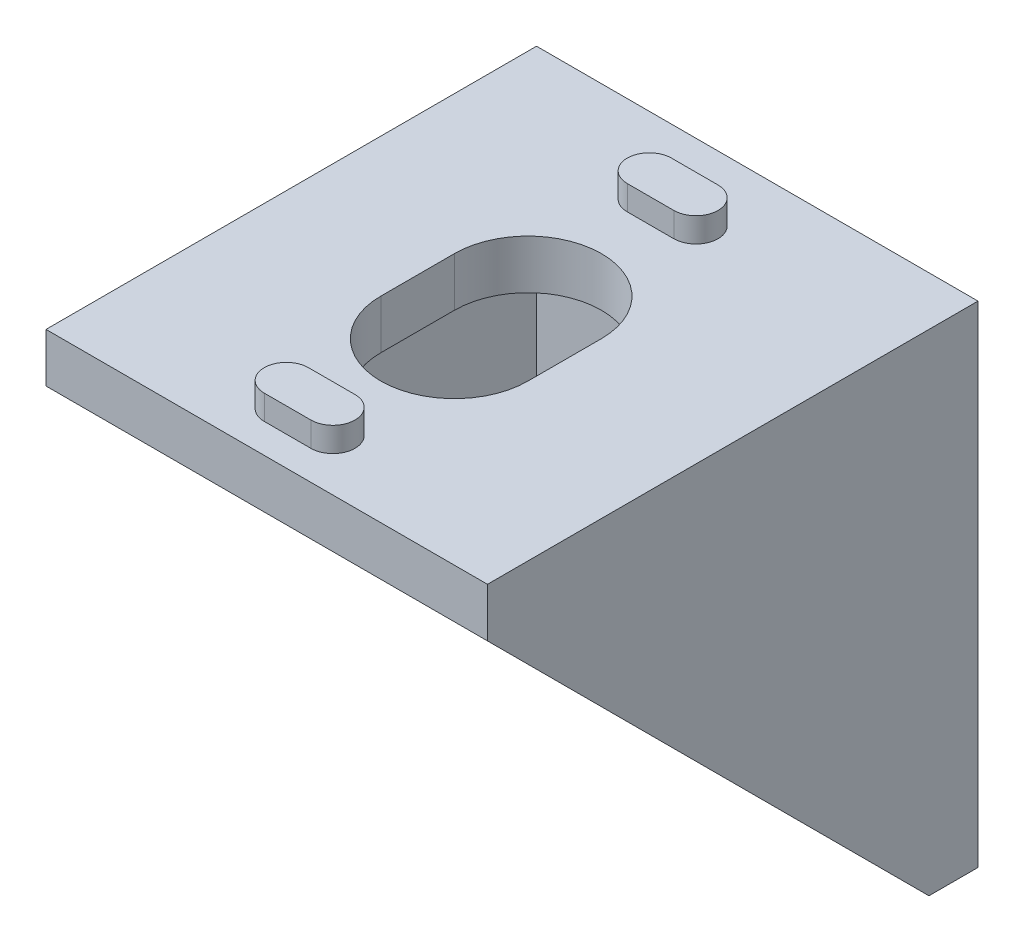
ISO-10303-21;
HEADER;
FILE_DESCRIPTION(('STEP AP214'),'2;1');
FILE_NAME('part.step','',(''),(''),'','','');
FILE_SCHEMA(('AUTOMOTIVE_DESIGN { 1 0 10303 214 1 1 1 1 }'));
ENDSEC;
DATA;
#1=APPLICATION_CONTEXT('core data for automotive mechanical design processes');
#2=APPLICATION_PROTOCOL_DEFINITION('international standard','automotive_design',2000,#1);
#3=PRODUCT_CONTEXT('',#1,'mechanical');
#4=PRODUCT('Part','Part','',(#3));
#5=PRODUCT_RELATED_PRODUCT_CATEGORY('part','',(#4));
#6=PRODUCT_DEFINITION_FORMATION('','',#4);
#7=PRODUCT_DEFINITION_CONTEXT('part definition',#1,'design');
#8=PRODUCT_DEFINITION('design','',#6,#7);
#9=PRODUCT_DEFINITION_SHAPE('','',#8);
#10=(LENGTH_UNIT() NAMED_UNIT(*) SI_UNIT(.MILLI.,.METRE.));
#11=(NAMED_UNIT(*) PLANE_ANGLE_UNIT() SI_UNIT($,.RADIAN.));
#12=(NAMED_UNIT(*) SI_UNIT($,.STERADIAN.) SOLID_ANGLE_UNIT());
#13=UNCERTAINTY_MEASURE_WITH_UNIT(LENGTH_MEASURE(1.E-05),#10,'distance_accuracy_value','');
#14=(GEOMETRIC_REPRESENTATION_CONTEXT(3) GLOBAL_UNCERTAINTY_ASSIGNED_CONTEXT((#13)) GLOBAL_UNIT_ASSIGNED_CONTEXT((#10,
#11,#12)) REPRESENTATION_CONTEXT('',''));
#15=CARTESIAN_POINT('',(0.,0.,0.));
#16=DIRECTION('',(0.,0.,1.));
#17=DIRECTION('',(1.,0.,0.));
#18=AXIS2_PLACEMENT_3D('',#15,#16,#17);
#19=CARTESIAN_POINT('',(-9.,10.,0.));
#20=DIRECTION('',(0.,0.,1.));
#21=DIRECTION('',(1.,0.,0.));
#22=AXIS2_PLACEMENT_3D('',#19,#20,#21);
#23=PLANE('',#22);
#24=DIRECTION('',(0.,-1.,0.));
#25=VECTOR('',#24,1.);
#26=CARTESIAN_POINT('',(-12.3501123042702,10.5,0.));
#27=LINE('',#26,#25);
#28=CARTESIAN_POINT('',(-12.3501123042702,11.,0.));
#29=VERTEX_POINT('',#28);
#30=CARTESIAN_POINT('',(-12.3501123042702,8.,0.));
#31=VERTEX_POINT('',#30);
#32=EDGE_CURVE('E383',#29,#31,#27,.T.);
#33=ORIENTED_EDGE('',*,*,#32,.T.);
#34=CARTESIAN_POINT('',(-9.35011230427015,8.,0.));
#35=DIRECTION('',(0.,0.,1.));
#36=DIRECTION('',(1.,0.,0.));
#37=AXIS2_PLACEMENT_3D('',#34,#35,#36);
#38=CIRCLE('',#37,3.);
#39=CARTESIAN_POINT('',(-6.35011230427015,8.,0.));
#40=VERTEX_POINT('',#39);
#41=EDGE_CURVE('E419',#31,#40,#38,.T.);
#42=ORIENTED_EDGE('',*,*,#41,.T.);
#43=DIRECTION('',(0.,1.,0.));
#44=VECTOR('',#43,1.);
#45=CARTESIAN_POINT('',(-6.35011230427015,9.,0.));
#46=LINE('',#45,#44);
#47=CARTESIAN_POINT('',(-6.35011230427015,11.,0.));
#48=VERTEX_POINT('',#47);
#49=EDGE_CURVE('E409',#40,#48,#46,.T.);
#50=ORIENTED_EDGE('',*,*,#49,.T.);
#51=CARTESIAN_POINT('',(-9.35011230427015,11.,0.));
#52=DIRECTION('',(0.,0.,1.));
#53=DIRECTION('',(-1.,0.,0.));
#54=AXIS2_PLACEMENT_3D('',#51,#52,#53);
#55=CIRCLE('',#54,3.);
#56=EDGE_CURVE('E400',#48,#29,#55,.T.);
#57=ORIENTED_EDGE('',*,*,#56,.T.);
#58=EDGE_LOOP('',(#33,#42,#50,#57));
#59=FACE_BOUND('',#58,.T.);
#60=CARTESIAN_POINT('',(-8.40011230427015,2.1,0.));
#61=DIRECTION('',(0.,0.,1.));
#62=DIRECTION('',(0.,1.,0.));
#63=AXIS2_PLACEMENT_3D('',#60,#61,#62);
#64=CIRCLE('',#63,0.9);
#65=CARTESIAN_POINT('',(-8.40011230427015,1.2,0.));
#66=VERTEX_POINT('',#65);
#67=CARTESIAN_POINT('',(-8.40011230427015,3.,0.));
#68=VERTEX_POINT('',#67);
#69=EDGE_CURVE('E299',#66,#68,#64,.T.);
#70=ORIENTED_EDGE('',*,*,#69,.T.);
#71=DIRECTION('',(-1.,0.,0.));
#72=VECTOR('',#71,1.);
#73=CARTESIAN_POINT('',(-9.65005615213507,3.,0.));
#74=LINE('',#73,#72);
#75=CARTESIAN_POINT('',(-10.3001123042701,3.,0.));
#76=VERTEX_POINT('',#75);
#77=EDGE_CURVE('E340',#68,#76,#74,.T.);
#78=ORIENTED_EDGE('',*,*,#77,.T.);
#79=CARTESIAN_POINT('',(-10.3001123042702,2.1,0.));
#80=DIRECTION('',(0.,0.,1.));
#81=DIRECTION('',(0.,-1.,0.));
#82=AXIS2_PLACEMENT_3D('',#79,#80,#81);
#83=CIRCLE('',#82,0.9);
#84=CARTESIAN_POINT('',(-10.3001123042702,1.2,0.));
#85=VERTEX_POINT('',#84);
#86=EDGE_CURVE('E301',#76,#85,#83,.T.);
#87=ORIENTED_EDGE('',*,*,#86,.T.);
#88=DIRECTION('',(1.,0.,0.));
#89=VECTOR('',#88,1.);
#90=CARTESIAN_POINT('',(-8.70005615213508,1.2,0.));
#91=LINE('',#90,#89);
#92=EDGE_CURVE('E294',#85,#66,#91,.T.);
#93=ORIENTED_EDGE('',*,*,#92,.T.);
#94=EDGE_LOOP('',(#70,#78,#87,#93));
#95=FACE_BOUND('',#94,.T.);
#96=DIRECTION('',(1.,0.,0.));
#97=VECTOR('',#96,1.);
#98=CARTESIAN_POINT('',(-8.70005615213507,16.,0.));
#99=LINE('',#98,#97);
#100=CARTESIAN_POINT('',(-10.3001123042702,16.,0.));
#101=VERTEX_POINT('',#100);
#102=CARTESIAN_POINT('',(-8.40011230427015,16.,0.));
#103=VERTEX_POINT('',#102);
#104=EDGE_CURVE('E1059',#101,#103,#99,.T.);
#105=ORIENTED_EDGE('',*,*,#104,.T.);
#106=CARTESIAN_POINT('',(-8.40011230427015,16.9,0.));
#107=DIRECTION('',(0.,0.,1.));
#108=DIRECTION('',(0.,1.,0.));
#109=AXIS2_PLACEMENT_3D('',#106,#107,#108);
#110=CIRCLE('',#109,0.9);
#111=CARTESIAN_POINT('',(-8.40011230427015,17.8,0.));
#112=VERTEX_POINT('',#111);
#113=EDGE_CURVE('E615',#103,#112,#110,.T.);
#114=ORIENTED_EDGE('',*,*,#113,.T.);
#115=DIRECTION('',(-1.,0.,0.));
#116=VECTOR('',#115,1.);
#117=CARTESIAN_POINT('',(-9.65005615213508,17.8,0.));
#118=LINE('',#117,#116);
#119=CARTESIAN_POINT('',(-10.3001123042702,17.8,0.));
#120=VERTEX_POINT('',#119);
#121=EDGE_CURVE('E633',#112,#120,#118,.T.);
#122=ORIENTED_EDGE('',*,*,#121,.T.);
#123=CARTESIAN_POINT('',(-10.3001123042702,16.9,0.));
#124=DIRECTION('',(0.,0.,1.));
#125=DIRECTION('',(0.,-1.,0.));
#126=AXIS2_PLACEMENT_3D('',#123,#124,#125);
#127=CIRCLE('',#126,0.9);
#128=EDGE_CURVE('E328',#120,#101,#127,.T.);
#129=ORIENTED_EDGE('',*,*,#128,.T.);
#130=EDGE_LOOP('',(#105,#114,#122,#129));
#131=FACE_BOUND('',#130,.T.);
#132=DIRECTION('',(0.,1.,0.));
#133=VECTOR('',#132,1.);
#134=CARTESIAN_POINT('',(0.,0.,0.));
#135=LINE('',#134,#133);
#136=CARTESIAN_POINT('',(0.,0.,0.));
#137=VERTEX_POINT('',#136);
#138=CARTESIAN_POINT('',(0.,20.,0.));
#139=VERTEX_POINT('',#138);
#140=EDGE_CURVE('E11',#137,#139,#135,.T.);
#141=ORIENTED_EDGE('',*,*,#140,.F.);
#142=DIRECTION('',(1.,0.,0.));
#143=VECTOR('',#142,1.);
#144=CARTESIAN_POINT('',(-18.,0.,0.));
#145=LINE('',#144,#143);
#146=CARTESIAN_POINT('',(-18.,0.,0.));
#147=VERTEX_POINT('',#146);
#148=EDGE_CURVE('E366',#147,#137,#145,.T.);
#149=ORIENTED_EDGE('',*,*,#148,.F.);
#150=DIRECTION('',(0.,-1.,0.));
#151=VECTOR('',#150,1.);
#152=CARTESIAN_POINT('',(-18.,20.,0.));
#153=LINE('',#152,#151);
#154=CARTESIAN_POINT('',(-18.,20.,0.));
#155=VERTEX_POINT('',#154);
#156=EDGE_CURVE('E374',#155,#147,#153,.T.);
#157=ORIENTED_EDGE('',*,*,#156,.F.);
#158=DIRECTION('',(-1.,0.,0.));
#159=VECTOR('',#158,1.);
#160=CARTESIAN_POINT('',(0.,20.,0.));
#161=LINE('',#160,#159);
#162=EDGE_CURVE('E44',#139,#155,#161,.T.);
#163=ORIENTED_EDGE('',*,*,#162,.F.);
#164=EDGE_LOOP('',(#141,#149,#157,#163));
#165=FACE_BOUND('',#164,.T.);
#166=ADVANCED_FACE('F17',(#59,#95,#131,#165),#23,.F.);
#167=CARTESIAN_POINT('',(0.,0.,0.));
#168=DIRECTION('',(1.,0.,0.));
#169=DIRECTION('',(0.,1.,0.));
#170=AXIS2_PLACEMENT_3D('',#167,#168,#169);
#171=PLANE('',#170);
#172=ORIENTED_EDGE('',*,*,#140,.T.);
#173=DIRECTION('',(0.,0.,1.));
#174=VECTOR('',#173,1.);
#175=CARTESIAN_POINT('',(0.,20.,0.));
#176=LINE('',#175,#174);
#177=CARTESIAN_POINT('',(0.,20.,20.));
#178=VERTEX_POINT('',#177);
#179=EDGE_CURVE('E20',#139,#178,#176,.T.);
#180=ORIENTED_EDGE('',*,*,#179,.T.);
#181=DIRECTION('',(0.,1.,0.));
#182=VECTOR('',#181,1.);
#183=CARTESIAN_POINT('',(0.,0.,20.));
#184=LINE('',#183,#182);
#185=CARTESIAN_POINT('',(0.,18.,20.));
#186=VERTEX_POINT('',#185);
#187=EDGE_CURVE('E484',#186,#178,#184,.T.);
#188=ORIENTED_EDGE('',*,*,#187,.F.);
#189=DIRECTION('',(0.,-0.707106781186548,-0.707106781186548));
#190=VECTOR('',#189,1.);
#191=CARTESIAN_POINT('',(0.,18.,20.));
#192=LINE('',#191,#190);
#193=CARTESIAN_POINT('',(0.,0.,2.));
#194=VERTEX_POINT('',#193);
#195=EDGE_CURVE('E463',#186,#194,#192,.T.);
#196=ORIENTED_EDGE('',*,*,#195,.T.);
#197=DIRECTION('',(0.,0.,1.));
#198=VECTOR('',#197,1.);
#199=CARTESIAN_POINT('',(0.,0.,0.));
#200=LINE('',#199,#198);
#201=EDGE_CURVE('E365',#137,#194,#200,.T.);
#202=ORIENTED_EDGE('',*,*,#201,.F.);
#203=EDGE_LOOP('',(#172,#180,#188,#196,#202));
#204=FACE_BOUND('',#203,.T.);
#205=ADVANCED_FACE('F681',(#204),#171,.T.);
#206=CARTESIAN_POINT('',(0.,20.,0.));
#207=DIRECTION('',(0.,1.,0.));
#208=DIRECTION('',(1.,0.,0.));
#209=AXIS2_PLACEMENT_3D('',#206,#207,#208);
#210=PLANE('',#209);
#211=DIRECTION('',(0.,0.,-1.));
#212=VECTOR('',#211,1.);
#213=CARTESIAN_POINT('',(-12.3501123042702,20.,6.));
#214=LINE('',#213,#212);
#215=CARTESIAN_POINT('',(-12.3501123042702,20.,12.));
#216=VERTEX_POINT('',#215);
#217=CARTESIAN_POINT('',(-12.3501123042702,20.,9.));
#218=VERTEX_POINT('',#217);
#219=EDGE_CURVE('E521',#216,#218,#214,.T.);
#220=ORIENTED_EDGE('',*,*,#219,.T.);
#221=CARTESIAN_POINT('',(-9.35011230427015,20.,9.));
#222=DIRECTION('',(0.,-1.,0.));
#223=DIRECTION('',(1.,0.,0.));
#224=AXIS2_PLACEMENT_3D('',#221,#222,#223);
#225=CIRCLE('',#224,3.);
#226=CARTESIAN_POINT('',(-6.35011230427015,20.,9.));
#227=VERTEX_POINT('',#226);
#228=EDGE_CURVE('E549',#218,#227,#225,.T.);
#229=ORIENTED_EDGE('',*,*,#228,.T.);
#230=DIRECTION('',(0.,0.,1.));
#231=VECTOR('',#230,1.);
#232=CARTESIAN_POINT('',(-6.35011230427015,20.,4.5));
#233=LINE('',#232,#231);
#234=CARTESIAN_POINT('',(-6.35011230427015,20.,12.));
#235=VERTEX_POINT('',#234);
#236=EDGE_CURVE('E439',#227,#235,#233,.T.);
#237=ORIENTED_EDGE('',*,*,#236,.T.);
#238=CARTESIAN_POINT('',(-9.35011230427015,20.,12.));
#239=DIRECTION('',(0.,-1.,0.));
#240=DIRECTION('',(-1.,0.,0.));
#241=AXIS2_PLACEMENT_3D('',#238,#239,#240);
#242=CIRCLE('',#241,3.);
#243=EDGE_CURVE('E529',#235,#216,#242,.T.);
#244=ORIENTED_EDGE('',*,*,#243,.T.);
#245=EDGE_LOOP('',(#220,#229,#237,#244));
#246=FACE_BOUND('',#245,.T.);
#247=DIRECTION('',(-1.,0.,0.));
#248=VECTOR('',#247,1.);
#249=CARTESIAN_POINT('',(-5.15005615213508,20.,4.));
#250=LINE('',#249,#248);
#251=CARTESIAN_POINT('',(-8.40011230427015,20.,4.));
#252=VERTEX_POINT('',#251);
#253=CARTESIAN_POINT('',(-10.3001123042702,20.,4.));
#254=VERTEX_POINT('',#253);
#255=EDGE_CURVE('E481',#252,#254,#250,.T.);
#256=ORIENTED_EDGE('',*,*,#255,.T.);
#257=CARTESIAN_POINT('',(-10.3001123042702,20.,3.1));
#258=DIRECTION('',(0.,-1.,0.));
#259=DIRECTION('',(0.,0.,-1.));
#260=AXIS2_PLACEMENT_3D('',#257,#258,#259);
#261=CIRCLE('',#260,0.9);
#262=CARTESIAN_POINT('',(-10.3001123042702,20.,2.2));
#263=VERTEX_POINT('',#262);
#264=EDGE_CURVE('E422',#254,#263,#261,.T.);
#265=ORIENTED_EDGE('',*,*,#264,.T.);
#266=DIRECTION('',(1.,0.,0.));
#267=VECTOR('',#266,1.);
#268=CARTESIAN_POINT('',(-4.20005615213507,20.,2.2));
#269=LINE('',#268,#267);
#270=CARTESIAN_POINT('',(-8.40011230427015,20.,2.2));
#271=VERTEX_POINT('',#270);
#272=EDGE_CURVE('E505',#263,#271,#269,.T.);
#273=ORIENTED_EDGE('',*,*,#272,.T.);
#274=CARTESIAN_POINT('',(-8.40011230427015,20.,3.1));
#275=DIRECTION('',(0.,-1.,0.));
#276=DIRECTION('',(0.,0.,1.));
#277=AXIS2_PLACEMENT_3D('',#274,#275,#276);
#278=CIRCLE('',#277,0.9);
#279=EDGE_CURVE('E405',#271,#252,#278,.T.);
#280=ORIENTED_EDGE('',*,*,#279,.T.);
#281=EDGE_LOOP('',(#256,#265,#273,#280));
#282=FACE_BOUND('',#281,.T.);
#283=DIRECTION('',(-1.,0.,0.));
#284=VECTOR('',#283,1.);
#285=CARTESIAN_POINT('',(-5.15005615213508,20.,18.8));
#286=LINE('',#285,#284);
#287=CARTESIAN_POINT('',(-8.40011230427015,20.,18.8));
#288=VERTEX_POINT('',#287);
#289=CARTESIAN_POINT('',(-10.3001123042702,20.,18.8));
#290=VERTEX_POINT('',#289);
#291=EDGE_CURVE('E435',#288,#290,#286,.T.);
#292=ORIENTED_EDGE('',*,*,#291,.T.);
#293=CARTESIAN_POINT('',(-10.3001123042702,20.,17.9));
#294=DIRECTION('',(0.,-1.,0.));
#295=DIRECTION('',(0.,0.,-1.));
#296=AXIS2_PLACEMENT_3D('',#293,#294,#295);
#297=CIRCLE('',#296,0.9);
#298=CARTESIAN_POINT('',(-10.3001123042702,20.,17.));
#299=VERTEX_POINT('',#298);
#300=EDGE_CURVE('E452',#290,#299,#297,.T.);
#301=ORIENTED_EDGE('',*,*,#300,.T.);
#302=DIRECTION('',(1.,0.,0.));
#303=VECTOR('',#302,1.);
#304=CARTESIAN_POINT('',(-4.20005615213508,20.,17.));
#305=LINE('',#304,#303);
#306=CARTESIAN_POINT('',(-8.40011230427015,20.,17.));
#307=VERTEX_POINT('',#306);
#308=EDGE_CURVE('E462',#299,#307,#305,.T.);
#309=ORIENTED_EDGE('',*,*,#308,.T.);
#310=CARTESIAN_POINT('',(-8.40011230427015,20.,17.9));
#311=DIRECTION('',(0.,-1.,0.));
#312=DIRECTION('',(0.,0.,1.));
#313=AXIS2_PLACEMENT_3D('',#310,#311,#312);
#314=CIRCLE('',#313,0.9);
#315=EDGE_CURVE('E346',#307,#288,#314,.T.);
#316=ORIENTED_EDGE('',*,*,#315,.T.);
#317=EDGE_LOOP('',(#292,#301,#309,#316));
#318=FACE_BOUND('',#317,.T.);
#319=ORIENTED_EDGE('',*,*,#162,.T.);
#320=DIRECTION('',(0.,0.,1.));
#321=VECTOR('',#320,1.);
#322=CARTESIAN_POINT('',(-18.,20.,0.));
#323=LINE('',#322,#321);
#324=CARTESIAN_POINT('',(-18.,20.,20.));
#325=VERTEX_POINT('',#324);
#326=EDGE_CURVE('E546',#155,#325,#323,.T.);
#327=ORIENTED_EDGE('',*,*,#326,.T.);
#328=DIRECTION('',(-1.,0.,0.));
#329=VECTOR('',#328,1.);
#330=CARTESIAN_POINT('',(0.,20.,20.));
#331=LINE('',#330,#329);
#332=EDGE_CURVE('E591',#178,#325,#331,.T.);
#333=ORIENTED_EDGE('',*,*,#332,.F.);
#334=ORIENTED_EDGE('',*,*,#179,.F.);
#335=EDGE_LOOP('',(#319,#327,#333,#334));
#336=FACE_BOUND('',#335,.T.);
#337=ADVANCED_FACE('F684',(#246,#282,#318,#336),#210,.T.);
#338=CARTESIAN_POINT('',(-18.,20.,0.));
#339=DIRECTION('',(-1.,0.,0.));
#340=DIRECTION('',(0.,0.,1.));
#341=AXIS2_PLACEMENT_3D('',#338,#339,#340);
#342=PLANE('',#341);
#343=ORIENTED_EDGE('',*,*,#156,.T.);
#344=DIRECTION('',(0.,0.,1.));
#345=VECTOR('',#344,1.);
#346=CARTESIAN_POINT('',(-18.,0.,0.));
#347=LINE('',#346,#345);
#348=CARTESIAN_POINT('',(-18.,0.,2.));
#349=VERTEX_POINT('',#348);
#350=EDGE_CURVE('E370',#147,#349,#347,.T.);
#351=ORIENTED_EDGE('',*,*,#350,.T.);
#352=DIRECTION('',(0.,0.707106781186548,0.707106781186548));
#353=VECTOR('',#352,1.);
#354=CARTESIAN_POINT('',(-18.,0.,2.));
#355=LINE('',#354,#353);
#356=CARTESIAN_POINT('',(-18.,18.,20.));
#357=VERTEX_POINT('',#356);
#358=EDGE_CURVE('E578',#349,#357,#355,.T.);
#359=ORIENTED_EDGE('',*,*,#358,.T.);
#360=DIRECTION('',(0.,-1.,0.));
#361=VECTOR('',#360,1.);
#362=CARTESIAN_POINT('',(-18.,20.,20.));
#363=LINE('',#362,#361);
#364=EDGE_CURVE('E507',#325,#357,#363,.T.);
#365=ORIENTED_EDGE('',*,*,#364,.F.);
#366=ORIENTED_EDGE('',*,*,#326,.F.);
#367=EDGE_LOOP('',(#343,#351,#359,#365,#366));
#368=FACE_BOUND('',#367,.T.);
#369=ADVANCED_FACE('F689',(#368),#342,.T.);
#370=CARTESIAN_POINT('',(-18.,0.,0.));
#371=DIRECTION('',(0.,-1.,0.));
#372=DIRECTION('',(0.,0.,-1.));
#373=AXIS2_PLACEMENT_3D('',#370,#371,#372);
#374=PLANE('',#373);
#375=ORIENTED_EDGE('',*,*,#148,.T.);
#376=ORIENTED_EDGE('',*,*,#201,.T.);
#377=DIRECTION('',(1.,0.,0.));
#378=VECTOR('',#377,1.);
#379=CARTESIAN_POINT('',(-18.,0.,2.));
#380=LINE('',#379,#378);
#381=CARTESIAN_POINT('',(-2.,0.,2.));
#382=VERTEX_POINT('',#381);
#383=EDGE_CURVE('E450',#382,#194,#380,.T.);
#384=ORIENTED_EDGE('',*,*,#383,.F.);
#385=DIRECTION('',(1.,0.,0.));
#386=VECTOR('',#385,1.);
#387=CARTESIAN_POINT('',(-18.,0.,2.));
#388=LINE('',#387,#386);
#389=CARTESIAN_POINT('',(-16.,0.,2.));
#390=VERTEX_POINT('',#389);
#391=EDGE_CURVE('E498',#390,#382,#388,.T.);
#392=ORIENTED_EDGE('',*,*,#391,.F.);
#393=DIRECTION('',(1.,0.,0.));
#394=VECTOR('',#393,1.);
#395=CARTESIAN_POINT('',(-18.,0.,2.));
#396=LINE('',#395,#394);
#397=EDGE_CURVE('E582',#349,#390,#396,.T.);
#398=ORIENTED_EDGE('',*,*,#397,.F.);
#399=ORIENTED_EDGE('',*,*,#350,.F.);
#400=EDGE_LOOP('',(#375,#376,#384,#392,#398,#399));
#401=FACE_BOUND('',#400,.T.);
#402=ADVANCED_FACE('F718',(#401),#374,.T.);
#403=CARTESIAN_POINT('',(-9.,19.,20.));
#404=DIRECTION('',(0.,0.,1.));
#405=DIRECTION('',(1.,0.,0.));
#406=AXIS2_PLACEMENT_3D('',#403,#404,#405);
#407=PLANE('',#406);
#408=ORIENTED_EDGE('',*,*,#187,.T.);
#409=ORIENTED_EDGE('',*,*,#332,.T.);
#410=ORIENTED_EDGE('',*,*,#364,.T.);
#411=DIRECTION('',(1.,0.,0.));
#412=VECTOR('',#411,1.);
#413=CARTESIAN_POINT('',(-18.,18.,20.));
#414=LINE('',#413,#412);
#415=CARTESIAN_POINT('',(-16.,18.,20.));
#416=VERTEX_POINT('',#415);
#417=EDGE_CURVE('E485',#357,#416,#414,.T.);
#418=ORIENTED_EDGE('',*,*,#417,.T.);
#419=DIRECTION('',(1.,0.,0.));
#420=VECTOR('',#419,1.);
#421=CARTESIAN_POINT('',(-18.,18.,20.));
#422=LINE('',#421,#420);
#423=CARTESIAN_POINT('',(-2.,18.,20.));
#424=VERTEX_POINT('',#423);
#425=EDGE_CURVE('E497',#416,#424,#422,.T.);
#426=ORIENTED_EDGE('',*,*,#425,.T.);
#427=DIRECTION('',(1.,0.,0.));
#428=VECTOR('',#427,1.);
#429=CARTESIAN_POINT('',(-18.,18.,20.));
#430=LINE('',#429,#428);
#431=EDGE_CURVE('E468',#424,#186,#430,.T.);
#432=ORIENTED_EDGE('',*,*,#431,.T.);
#433=EDGE_LOOP('',(#408,#409,#410,#418,#426,#432));
#434=FACE_BOUND('',#433,.T.);
#435=ADVANCED_FACE('F720',(#434),#407,.T.);
#436=CARTESIAN_POINT('',(-16.,9.,11.));
#437=DIRECTION('',(1.,0.,0.));
#438=DIRECTION('',(0.,1.,0.));
#439=AXIS2_PLACEMENT_3D('',#436,#437,#438);
#440=PLANE('',#439);
#441=DIRECTION('',(0.,-0.707106781186548,-0.707106781186548));
#442=VECTOR('',#441,1.);
#443=CARTESIAN_POINT('',(-16.,0.,2.));
#444=LINE('',#443,#442);
#445=EDGE_CURVE('E486',#416,#390,#444,.T.);
#446=ORIENTED_EDGE('',*,*,#445,.T.);
#447=DIRECTION('',(0.,-1.,0.));
#448=VECTOR('',#447,1.);
#449=CARTESIAN_POINT('',(-16.,9.5,2.));
#450=LINE('',#449,#448);
#451=CARTESIAN_POINT('',(-16.,18.,2.));
#452=VERTEX_POINT('',#451);
#453=EDGE_CURVE('E575',#452,#390,#450,.T.);
#454=ORIENTED_EDGE('',*,*,#453,.F.);
#455=DIRECTION('',(0.,0.,-1.));
#456=VECTOR('',#455,1.);
#457=CARTESIAN_POINT('',(-16.,18.,6.5));
#458=LINE('',#457,#456);
#459=EDGE_CURVE('E496',#416,#452,#458,.T.);
#460=ORIENTED_EDGE('',*,*,#459,.F.);
#461=EDGE_LOOP('',(#446,#454,#460));
#462=FACE_BOUND('',#461,.T.);
#463=ADVANCED_FACE('F716',(#462),#440,.T.);
#464=CARTESIAN_POINT('',(-18.,18.,20.));
#465=DIRECTION('',(0.,-0.707106781186548,0.707106781186548));
#466=DIRECTION('',(-1.,0.,0.));
#467=AXIS2_PLACEMENT_3D('',#464,#465,#466);
#468=PLANE('',#467);
#469=ORIENTED_EDGE('',*,*,#358,.F.);
#470=ORIENTED_EDGE('',*,*,#397,.T.);
#471=ORIENTED_EDGE('',*,*,#445,.F.);
#472=ORIENTED_EDGE('',*,*,#417,.F.);
#473=EDGE_LOOP('',(#469,#470,#471,#472));
#474=FACE_BOUND('',#473,.T.);
#475=ADVANCED_FACE('F724',(#474),#468,.T.);
#476=CARTESIAN_POINT('',(-18.,18.,2.));
#477=DIRECTION('',(0.,-1.,0.));
#478=DIRECTION('',(0.,0.,-1.));
#479=AXIS2_PLACEMENT_3D('',#476,#477,#478);
#480=PLANE('',#479);
#481=DIRECTION('',(0.,0.,1.));
#482=VECTOR('',#481,1.);
#483=CARTESIAN_POINT('',(-12.3501123042702,18.,7.));
#484=LINE('',#483,#482);
#485=CARTESIAN_POINT('',(-12.3501123042702,18.,9.));
#486=VERTEX_POINT('',#485);
#487=CARTESIAN_POINT('',(-12.3501123042702,18.,12.));
#488=VERTEX_POINT('',#487);
#489=EDGE_CURVE('E533',#486,#488,#484,.T.);
#490=ORIENTED_EDGE('',*,*,#489,.T.);
#491=CARTESIAN_POINT('',(-9.35011230427015,18.,12.));
#492=DIRECTION('',(0.,1.,0.));
#493=DIRECTION('',(-1.,0.,0.));
#494=AXIS2_PLACEMENT_3D('',#491,#492,#493);
#495=CIRCLE('',#494,3.);
#496=CARTESIAN_POINT('',(-6.35011230427015,18.,12.));
#497=VERTEX_POINT('',#496);
#498=EDGE_CURVE('E436',#488,#497,#495,.T.);
#499=ORIENTED_EDGE('',*,*,#498,.T.);
#500=DIRECTION('',(0.,0.,-1.));
#501=VECTOR('',#500,1.);
#502=CARTESIAN_POINT('',(-6.35011230427015,18.,5.5));
#503=LINE('',#502,#501);
#504=CARTESIAN_POINT('',(-6.35011230427015,18.,9.));
#505=VERTEX_POINT('',#504);
#506=EDGE_CURVE('E543',#497,#505,#503,.T.);
#507=ORIENTED_EDGE('',*,*,#506,.T.);
#508=CARTESIAN_POINT('',(-9.35011230427015,18.,9.));
#509=DIRECTION('',(0.,1.,0.));
#510=DIRECTION('',(1.,0.,0.));
#511=AXIS2_PLACEMENT_3D('',#508,#509,#510);
#512=CIRCLE('',#511,3.);
#513=EDGE_CURVE('E467',#505,#486,#512,.T.);
#514=ORIENTED_EDGE('',*,*,#513,.T.);
#515=EDGE_LOOP('',(#490,#499,#507,#514));
#516=FACE_BOUND('',#515,.T.);
#517=DIRECTION('',(0.,0.,1.));
#518=VECTOR('',#517,1.);
#519=CARTESIAN_POINT('',(-2.,18.,6.5));
#520=LINE('',#519,#518);
#521=CARTESIAN_POINT('',(-2.,18.,2.));
#522=VERTEX_POINT('',#521);
#523=EDGE_CURVE('E443',#522,#424,#520,.T.);
#524=ORIENTED_EDGE('',*,*,#523,.T.);
#525=ORIENTED_EDGE('',*,*,#425,.F.);
#526=ORIENTED_EDGE('',*,*,#459,.T.);
#527=DIRECTION('',(-1.,0.,0.));
#528=VECTOR('',#527,1.);
#529=CARTESIAN_POINT('',(-13.5,18.,2.));
#530=LINE('',#529,#528);
#531=EDGE_CURVE('E568',#522,#452,#530,.T.);
#532=ORIENTED_EDGE('',*,*,#531,.F.);
#533=EDGE_LOOP('',(#524,#525,#526,#532));
#534=FACE_BOUND('',#533,.T.);
#535=ADVANCED_FACE('F725',(#516,#534),#480,.T.);
#536=CARTESIAN_POINT('',(-9.,10.,2.));
#537=DIRECTION('',(0.,0.,1.));
#538=DIRECTION('',(1.,0.,0.));
#539=AXIS2_PLACEMENT_3D('',#536,#537,#538);
#540=PLANE('',#539);
#541=DIRECTION('',(0.,1.,0.));
#542=VECTOR('',#541,1.);
#543=CARTESIAN_POINT('',(-12.3501123042702,10.5,2.));
#544=LINE('',#543,#542);
#545=CARTESIAN_POINT('',(-12.3501123042702,8.,2.));
#546=VERTEX_POINT('',#545);
#547=CARTESIAN_POINT('',(-12.3501123042702,11.,2.));
#548=VERTEX_POINT('',#547);
#549=EDGE_CURVE('E386',#546,#548,#544,.T.);
#550=ORIENTED_EDGE('',*,*,#549,.T.);
#551=CARTESIAN_POINT('',(-9.35011230427015,11.,2.));
#552=DIRECTION('',(0.,0.,-1.));
#553=DIRECTION('',(-1.,0.,0.));
#554=AXIS2_PLACEMENT_3D('',#551,#552,#553);
#555=CIRCLE('',#554,3.);
#556=CARTESIAN_POINT('',(-6.35011230427015,11.,2.));
#557=VERTEX_POINT('',#556);
#558=EDGE_CURVE('E408',#548,#557,#555,.T.);
#559=ORIENTED_EDGE('',*,*,#558,.T.);
#560=DIRECTION('',(0.,-1.,0.));
#561=VECTOR('',#560,1.);
#562=CARTESIAN_POINT('',(-6.35011230427015,9.,2.));
#563=LINE('',#562,#561);
#564=CARTESIAN_POINT('',(-6.35011230427015,8.,2.));
#565=VERTEX_POINT('',#564);
#566=EDGE_CURVE('E417',#557,#565,#563,.T.);
#567=ORIENTED_EDGE('',*,*,#566,.T.);
#568=CARTESIAN_POINT('',(-9.35011230427015,8.,2.));
#569=DIRECTION('',(0.,0.,-1.));
#570=DIRECTION('',(1.,0.,0.));
#571=AXIS2_PLACEMENT_3D('',#568,#569,#570);
#572=CIRCLE('',#571,3.);
#573=EDGE_CURVE('E424',#565,#546,#572,.T.);
#574=ORIENTED_EDGE('',*,*,#573,.T.);
#575=EDGE_LOOP('',(#550,#559,#567,#574));
#576=FACE_BOUND('',#575,.T.);
#577=DIRECTION('',(0.,1.,0.));
#578=VECTOR('',#577,1.);
#579=CARTESIAN_POINT('',(-2.,9.5,2.));
#580=LINE('',#579,#578);
#581=EDGE_CURVE('E448',#382,#522,#580,.T.);
#582=ORIENTED_EDGE('',*,*,#581,.T.);
#583=ORIENTED_EDGE('',*,*,#531,.T.);
#584=ORIENTED_EDGE('',*,*,#453,.T.);
#585=ORIENTED_EDGE('',*,*,#391,.T.);
#586=EDGE_LOOP('',(#582,#583,#584,#585));
#587=FACE_BOUND('',#586,.T.);
#588=ADVANCED_FACE('F659',(#576,#587),#540,.T.);
#589=CARTESIAN_POINT('',(-2.,9.,11.));
#590=DIRECTION('',(-1.,0.,0.));
#591=DIRECTION('',(0.,0.,1.));
#592=AXIS2_PLACEMENT_3D('',#589,#590,#591);
#593=PLANE('',#592);
#594=DIRECTION('',(0.,0.707106781186548,0.707106781186548));
#595=VECTOR('',#594,1.);
#596=CARTESIAN_POINT('',(-2.,18.,20.));
#597=LINE('',#596,#595);
#598=EDGE_CURVE('E559',#382,#424,#597,.T.);
#599=ORIENTED_EDGE('',*,*,#598,.T.);
#600=ORIENTED_EDGE('',*,*,#523,.F.);
#601=ORIENTED_EDGE('',*,*,#581,.F.);
#602=EDGE_LOOP('',(#599,#600,#601));
#603=FACE_BOUND('',#602,.T.);
#604=ADVANCED_FACE('F791',(#603),#593,.T.);
#605=CARTESIAN_POINT('',(0.,0.,2.));
#606=DIRECTION('',(0.,-0.707106781186548,0.707106781186548));
#607=DIRECTION('',(-1.,0.,0.));
#608=AXIS2_PLACEMENT_3D('',#605,#606,#607);
#609=PLANE('',#608);
#610=ORIENTED_EDGE('',*,*,#195,.F.);
#611=ORIENTED_EDGE('',*,*,#431,.F.);
#612=ORIENTED_EDGE('',*,*,#598,.F.);
#613=ORIENTED_EDGE('',*,*,#383,.T.);
#614=EDGE_LOOP('',(#610,#611,#612,#613));
#615=FACE_BOUND('',#614,.T.);
#616=ADVANCED_FACE('F786',(#615),#609,.T.);
#617=CARTESIAN_POINT('',(-9.35011230427015,20.,9.));
#618=DIRECTION('',(0.,-1.,0.));
#619=DIRECTION('',(1.,0.,0.));
#620=AXIS2_PLACEMENT_3D('',#617,#618,#619);
#621=CYLINDRICAL_SURFACE('',#620,3.);
#622=ORIENTED_EDGE('',*,*,#228,.F.);
#623=DIRECTION('',(0.,-1.,0.));
#624=VECTOR('',#623,1.);
#625=CARTESIAN_POINT('',(-12.3501123042702,20.,9.));
#626=LINE('',#625,#624);
#627=EDGE_CURVE('E528',#218,#486,#626,.T.);
#628=ORIENTED_EDGE('',*,*,#627,.T.);
#629=ORIENTED_EDGE('',*,*,#513,.F.);
#630=DIRECTION('',(0.,-1.,0.));
#631=VECTOR('',#630,1.);
#632=CARTESIAN_POINT('',(-6.35011230427015,20.,9.));
#633=LINE('',#632,#631);
#634=EDGE_CURVE('E537',#227,#505,#633,.T.);
#635=ORIENTED_EDGE('',*,*,#634,.F.);
#636=EDGE_LOOP('',(#622,#628,#629,#635));
#637=FACE_BOUND('',#636,.T.);
#638=ADVANCED_FACE('F783',(#637),#621,.F.);
#639=CARTESIAN_POINT('',(-6.35011230427015,20.,9.));
#640=DIRECTION('',(1.,0.,0.));
#641=DIRECTION('',(0.,1.,0.));
#642=AXIS2_PLACEMENT_3D('',#639,#640,#641);
#643=PLANE('',#642);
#644=ORIENTED_EDGE('',*,*,#236,.F.);
#645=ORIENTED_EDGE('',*,*,#634,.T.);
#646=ORIENTED_EDGE('',*,*,#506,.F.);
#647=DIRECTION('',(0.,-1.,0.));
#648=VECTOR('',#647,1.);
#649=CARTESIAN_POINT('',(-6.35011230427015,20.,12.));
#650=LINE('',#649,#648);
#651=EDGE_CURVE('E442',#235,#497,#650,.T.);
#652=ORIENTED_EDGE('',*,*,#651,.F.);
#653=EDGE_LOOP('',(#644,#645,#646,#652));
#654=FACE_BOUND('',#653,.T.);
#655=ADVANCED_FACE('F780',(#654),#643,.F.);
#656=CARTESIAN_POINT('',(-9.35011230427015,20.,12.));
#657=DIRECTION('',(0.,-1.,0.));
#658=DIRECTION('',(-1.,0.,0.));
#659=AXIS2_PLACEMENT_3D('',#656,#657,#658);
#660=CYLINDRICAL_SURFACE('',#659,3.);
#661=ORIENTED_EDGE('',*,*,#243,.F.);
#662=ORIENTED_EDGE('',*,*,#651,.T.);
#663=ORIENTED_EDGE('',*,*,#498,.F.);
#664=DIRECTION('',(0.,-1.,0.));
#665=VECTOR('',#664,1.);
#666=CARTESIAN_POINT('',(-12.3501123042702,20.,12.));
#667=LINE('',#666,#665);
#668=EDGE_CURVE('E524',#216,#488,#667,.T.);
#669=ORIENTED_EDGE('',*,*,#668,.F.);
#670=EDGE_LOOP('',(#661,#662,#663,#669));
#671=FACE_BOUND('',#670,.T.);
#672=ADVANCED_FACE('F755',(#671),#660,.F.);
#673=CARTESIAN_POINT('',(-12.3501123042702,20.,12.));
#674=DIRECTION('',(-1.,0.,0.));
#675=DIRECTION('',(0.,0.,1.));
#676=AXIS2_PLACEMENT_3D('',#673,#674,#675);
#677=PLANE('',#676);
#678=ORIENTED_EDGE('',*,*,#219,.F.);
#679=ORIENTED_EDGE('',*,*,#668,.T.);
#680=ORIENTED_EDGE('',*,*,#489,.F.);
#681=ORIENTED_EDGE('',*,*,#627,.F.);
#682=EDGE_LOOP('',(#678,#679,#680,#681));
#683=FACE_BOUND('',#682,.T.);
#684=ADVANCED_FACE('F773',(#683),#677,.F.);
#685=CARTESIAN_POINT('',(-9.35011230427015,21.,3.1));
#686=DIRECTION('',(0.,1.,0.));
#687=DIRECTION('',(1.,0.,0.));
#688=AXIS2_PLACEMENT_3D('',#685,#686,#687);
#689=PLANE('',#688);
#690=CARTESIAN_POINT('',(-8.40011230427015,21.,3.1));
#691=DIRECTION('',(0.,1.,0.));
#692=DIRECTION('',(0.,0.,1.));
#693=AXIS2_PLACEMENT_3D('',#690,#691,#692);
#694=CIRCLE('',#693,0.9);
#695=CARTESIAN_POINT('',(-8.40011230427015,21.,4.));
#696=VERTEX_POINT('',#695);
#697=CARTESIAN_POINT('',(-8.40011230427015,21.,2.2));
#698=VERTEX_POINT('',#697);
#699=EDGE_CURVE('E402',#696,#698,#694,.T.);
#700=ORIENTED_EDGE('',*,*,#699,.T.);
#701=DIRECTION('',(-1.,0.,0.));
#702=VECTOR('',#701,1.);
#703=CARTESIAN_POINT('',(-8.40011230427015,21.,2.2));
#704=LINE('',#703,#702);
#705=CARTESIAN_POINT('',(-10.3001123042702,21.,2.2));
#706=VERTEX_POINT('',#705);
#707=EDGE_CURVE('E513',#698,#706,#704,.T.);
#708=ORIENTED_EDGE('',*,*,#707,.T.);
#709=CARTESIAN_POINT('',(-10.3001123042702,21.,3.1));
#710=DIRECTION('',(0.,1.,0.));
#711=DIRECTION('',(0.,0.,-1.));
#712=AXIS2_PLACEMENT_3D('',#709,#710,#711);
#713=CIRCLE('',#712,0.9);
#714=CARTESIAN_POINT('',(-10.3001123042702,21.,4.));
#715=VERTEX_POINT('',#714);
#716=EDGE_CURVE('E427',#706,#715,#713,.T.);
#717=ORIENTED_EDGE('',*,*,#716,.T.);
#718=DIRECTION('',(1.,0.,0.));
#719=VECTOR('',#718,1.);
#720=CARTESIAN_POINT('',(-10.3001123042702,21.,4.));
#721=LINE('',#720,#719);
#722=EDGE_CURVE('E376',#715,#696,#721,.T.);
#723=ORIENTED_EDGE('',*,*,#722,.T.);
#724=EDGE_LOOP('',(#700,#708,#717,#723));
#725=FACE_BOUND('',#724,.T.);
#726=ADVANCED_FACE('F772',(#725),#689,.T.);
#727=CARTESIAN_POINT('',(-8.40011230427015,20.,3.1));
#728=DIRECTION('',(0.,1.,0.));
#729=DIRECTION('',(0.,0.,1.));
#730=AXIS2_PLACEMENT_3D('',#727,#728,#729);
#731=CYLINDRICAL_SURFACE('',#730,0.9);
#732=ORIENTED_EDGE('',*,*,#279,.F.);
#733=DIRECTION('',(0.,1.,0.));
#734=VECTOR('',#733,1.);
#735=CARTESIAN_POINT('',(-8.40011230427015,20.,2.2));
#736=LINE('',#735,#734);
#737=EDGE_CURVE('E404',#271,#698,#736,.T.);
#738=ORIENTED_EDGE('',*,*,#737,.T.);
#739=ORIENTED_EDGE('',*,*,#699,.F.);
#740=DIRECTION('',(0.,1.,0.));
#741=VECTOR('',#740,1.);
#742=CARTESIAN_POINT('',(-8.40011230427015,20.,4.));
#743=LINE('',#742,#741);
#744=EDGE_CURVE('E381',#252,#696,#743,.T.);
#745=ORIENTED_EDGE('',*,*,#744,.F.);
#746=EDGE_LOOP('',(#732,#738,#739,#745));
#747=FACE_BOUND('',#746,.T.);
#748=ADVANCED_FACE('F770',(#747),#731,.T.);
#749=CARTESIAN_POINT('',(-8.40011230427015,20.,2.2));
#750=DIRECTION('',(0.,0.,-1.));
#751=DIRECTION('',(-1.,0.,0.));
#752=AXIS2_PLACEMENT_3D('',#749,#750,#751);
#753=PLANE('',#752);
#754=ORIENTED_EDGE('',*,*,#272,.F.);
#755=DIRECTION('',(0.,1.,0.));
#756=VECTOR('',#755,1.);
#757=CARTESIAN_POINT('',(-10.3001123042702,20.,2.2));
#758=LINE('',#757,#756);
#759=EDGE_CURVE('E501',#263,#706,#758,.T.);
#760=ORIENTED_EDGE('',*,*,#759,.T.);
#761=ORIENTED_EDGE('',*,*,#707,.F.);
#762=ORIENTED_EDGE('',*,*,#737,.F.);
#763=EDGE_LOOP('',(#754,#760,#761,#762));
#764=FACE_BOUND('',#763,.T.);
#765=ADVANCED_FACE('F763',(#764),#753,.T.);
#766=CARTESIAN_POINT('',(-10.3001123042702,20.,3.1));
#767=DIRECTION('',(0.,1.,0.));
#768=DIRECTION('',(0.,0.,-1.));
#769=AXIS2_PLACEMENT_3D('',#766,#767,#768);
#770=CYLINDRICAL_SURFACE('',#769,0.9);
#771=ORIENTED_EDGE('',*,*,#264,.F.);
#772=DIRECTION('',(0.,1.,0.));
#773=VECTOR('',#772,1.);
#774=CARTESIAN_POINT('',(-10.3001123042702,20.,4.));
#775=LINE('',#774,#773);
#776=EDGE_CURVE('E379',#254,#715,#775,.T.);
#777=ORIENTED_EDGE('',*,*,#776,.T.);
#778=ORIENTED_EDGE('',*,*,#716,.F.);
#779=ORIENTED_EDGE('',*,*,#759,.F.);
#780=EDGE_LOOP('',(#771,#777,#778,#779));
#781=FACE_BOUND('',#780,.T.);
#782=ADVANCED_FACE('F757',(#781),#770,.T.);
#783=CARTESIAN_POINT('',(-10.3001123042702,20.,4.));
#784=DIRECTION('',(0.,0.,1.));
#785=DIRECTION('',(1.,0.,0.));
#786=AXIS2_PLACEMENT_3D('',#783,#784,#785);
#787=PLANE('',#786);
#788=ORIENTED_EDGE('',*,*,#255,.F.);
#789=ORIENTED_EDGE('',*,*,#744,.T.);
#790=ORIENTED_EDGE('',*,*,#722,.F.);
#791=ORIENTED_EDGE('',*,*,#776,.F.);
#792=EDGE_LOOP('',(#788,#789,#790,#791));
#793=FACE_BOUND('',#792,.T.);
#794=ADVANCED_FACE('F756',(#793),#787,.T.);
#795=CARTESIAN_POINT('',(-9.35011230427015,21.,17.9));
#796=DIRECTION('',(0.,1.,0.));
#797=DIRECTION('',(1.,0.,0.));
#798=AXIS2_PLACEMENT_3D('',#795,#796,#797);
#799=PLANE('',#798);
#800=CARTESIAN_POINT('',(-8.40011230427015,21.,17.9));
#801=DIRECTION('',(0.,1.,0.));
#802=DIRECTION('',(0.,0.,1.));
#803=AXIS2_PLACEMENT_3D('',#800,#801,#802);
#804=CIRCLE('',#803,0.9);
#805=CARTESIAN_POINT('',(-8.40011230427015,21.,18.8));
#806=VERTEX_POINT('',#805);
#807=CARTESIAN_POINT('',(-8.40011230427015,21.,17.));
#808=VERTEX_POINT('',#807);
#809=EDGE_CURVE('E349',#806,#808,#804,.T.);
#810=ORIENTED_EDGE('',*,*,#809,.T.);
#811=DIRECTION('',(-1.,0.,0.));
#812=VECTOR('',#811,1.);
#813=CARTESIAN_POINT('',(-8.40011230427015,21.,17.));
#814=LINE('',#813,#812);
#815=CARTESIAN_POINT('',(-10.3001123042702,21.,17.));
#816=VERTEX_POINT('',#815);
#817=EDGE_CURVE('E471',#808,#816,#814,.T.);
#818=ORIENTED_EDGE('',*,*,#817,.T.);
#819=CARTESIAN_POINT('',(-10.3001123042702,21.,17.9));
#820=DIRECTION('',(0.,1.,0.));
#821=DIRECTION('',(0.,0.,-1.));
#822=AXIS2_PLACEMENT_3D('',#819,#820,#821);
#823=CIRCLE('',#822,0.9);
#824=CARTESIAN_POINT('',(-10.3001123042702,21.,18.8));
#825=VERTEX_POINT('',#824);
#826=EDGE_CURVE('E458',#816,#825,#823,.T.);
#827=ORIENTED_EDGE('',*,*,#826,.T.);
#828=DIRECTION('',(1.,0.,0.));
#829=VECTOR('',#828,1.);
#830=CARTESIAN_POINT('',(-10.3001123042702,21.,18.8));
#831=LINE('',#830,#829);
#832=EDGE_CURVE('E354',#825,#806,#831,.T.);
#833=ORIENTED_EDGE('',*,*,#832,.T.);
#834=EDGE_LOOP('',(#810,#818,#827,#833));
#835=FACE_BOUND('',#834,.T.);
#836=ADVANCED_FACE('F741',(#835),#799,.T.);
#837=CARTESIAN_POINT('',(-8.40011230427015,20.,17.9));
#838=DIRECTION('',(0.,1.,0.));
#839=DIRECTION('',(0.,0.,1.));
#840=AXIS2_PLACEMENT_3D('',#837,#838,#839);
#841=CYLINDRICAL_SURFACE('',#840,0.9);
#842=ORIENTED_EDGE('',*,*,#315,.F.);
#843=DIRECTION('',(0.,1.,0.));
#844=VECTOR('',#843,1.);
#845=CARTESIAN_POINT('',(-8.40011230427015,20.,17.));
#846=LINE('',#845,#844);
#847=EDGE_CURVE('E351',#307,#808,#846,.T.);
#848=ORIENTED_EDGE('',*,*,#847,.T.);
#849=ORIENTED_EDGE('',*,*,#809,.F.);
#850=DIRECTION('',(0.,1.,0.));
#851=VECTOR('',#850,1.);
#852=CARTESIAN_POINT('',(-8.40011230427015,20.,18.8));
#853=LINE('',#852,#851);
#854=EDGE_CURVE('E359',#288,#806,#853,.T.);
#855=ORIENTED_EDGE('',*,*,#854,.F.);
#856=EDGE_LOOP('',(#842,#848,#849,#855));
#857=FACE_BOUND('',#856,.T.);
#858=ADVANCED_FACE('F737',(#857),#841,.T.);
#859=CARTESIAN_POINT('',(-8.40011230427015,20.,17.));
#860=DIRECTION('',(0.,0.,-1.));
#861=DIRECTION('',(0.,-1.,0.));
#862=AXIS2_PLACEMENT_3D('',#859,#860,#861);
#863=PLANE('',#862);
#864=ORIENTED_EDGE('',*,*,#308,.F.);
#865=DIRECTION('',(0.,1.,0.));
#866=VECTOR('',#865,1.);
#867=CARTESIAN_POINT('',(-10.3001123042702,20.,17.));
#868=LINE('',#867,#866);
#869=EDGE_CURVE('E457',#299,#816,#868,.T.);
#870=ORIENTED_EDGE('',*,*,#869,.T.);
#871=ORIENTED_EDGE('',*,*,#817,.F.);
#872=ORIENTED_EDGE('',*,*,#847,.F.);
#873=EDGE_LOOP('',(#864,#870,#871,#872));
#874=FACE_BOUND('',#873,.T.);
#875=ADVANCED_FACE('F712',(#874),#863,.T.);
#876=CARTESIAN_POINT('',(-10.3001123042702,20.,17.9));
#877=DIRECTION('',(0.,1.,0.));
#878=DIRECTION('',(0.,0.,-1.));
#879=AXIS2_PLACEMENT_3D('',#876,#877,#878);
#880=CYLINDRICAL_SURFACE('',#879,0.9);
#881=ORIENTED_EDGE('',*,*,#300,.F.);
#882=DIRECTION('',(0.,1.,0.));
#883=VECTOR('',#882,1.);
#884=CARTESIAN_POINT('',(-10.3001123042702,20.,18.8));
#885=LINE('',#884,#883);
#886=EDGE_CURVE('E357',#290,#825,#885,.T.);
#887=ORIENTED_EDGE('',*,*,#886,.T.);
#888=ORIENTED_EDGE('',*,*,#826,.F.);
#889=ORIENTED_EDGE('',*,*,#869,.F.);
#890=EDGE_LOOP('',(#881,#887,#888,#889));
#891=FACE_BOUND('',#890,.T.);
#892=ADVANCED_FACE('F709',(#891),#880,.T.);
#893=CARTESIAN_POINT('',(-10.3001123042702,20.,18.8));
#894=DIRECTION('',(0.,0.,1.));
#895=DIRECTION('',(1.,0.,0.));
#896=AXIS2_PLACEMENT_3D('',#893,#894,#895);
#897=PLANE('',#896);
#898=ORIENTED_EDGE('',*,*,#291,.F.);
#899=ORIENTED_EDGE('',*,*,#854,.T.);
#900=ORIENTED_EDGE('',*,*,#832,.F.);
#901=ORIENTED_EDGE('',*,*,#886,.F.);
#902=EDGE_LOOP('',(#898,#899,#900,#901));
#903=FACE_BOUND('',#902,.T.);
#904=ADVANCED_FACE('F676',(#903),#897,.T.);
#905=CARTESIAN_POINT('',(-9.35011230427015,8.,0.));
#906=DIRECTION('',(0.,0.,1.));
#907=DIRECTION('',(1.,0.,0.));
#908=AXIS2_PLACEMENT_3D('',#905,#906,#907);
#909=CYLINDRICAL_SURFACE('',#908,3.);
#910=ORIENTED_EDGE('',*,*,#41,.F.);
#911=DIRECTION('',(0.,0.,1.));
#912=VECTOR('',#911,1.);
#913=CARTESIAN_POINT('',(-12.3501123042702,8.,0.));
#914=LINE('',#913,#912);
#915=EDGE_CURVE('E394',#31,#546,#914,.T.);
#916=ORIENTED_EDGE('',*,*,#915,.T.);
#917=ORIENTED_EDGE('',*,*,#573,.F.);
#918=DIRECTION('',(0.,0.,1.));
#919=VECTOR('',#918,1.);
#920=CARTESIAN_POINT('',(-6.35011230427015,8.,0.));
#921=LINE('',#920,#919);
#922=EDGE_CURVE('E413',#40,#565,#921,.T.);
#923=ORIENTED_EDGE('',*,*,#922,.F.);
#924=EDGE_LOOP('',(#910,#916,#917,#923));
#925=FACE_BOUND('',#924,.T.);
#926=ADVANCED_FACE('F661',(#925),#909,.F.);
#927=CARTESIAN_POINT('',(-6.35011230427015,8.,0.));
#928=DIRECTION('',(1.,0.,0.));
#929=DIRECTION('',(0.,1.,0.));
#930=AXIS2_PLACEMENT_3D('',#927,#928,#929);
#931=PLANE('',#930);
#932=ORIENTED_EDGE('',*,*,#49,.F.);
#933=ORIENTED_EDGE('',*,*,#922,.T.);
#934=ORIENTED_EDGE('',*,*,#566,.F.);
#935=DIRECTION('',(0.,0.,1.));
#936=VECTOR('',#935,1.);
#937=CARTESIAN_POINT('',(-6.35011230427015,11.,0.));
#938=LINE('',#937,#936);
#939=EDGE_CURVE('E399',#48,#557,#938,.T.);
#940=ORIENTED_EDGE('',*,*,#939,.F.);
#941=EDGE_LOOP('',(#932,#933,#934,#940));
#942=FACE_BOUND('',#941,.T.);
#943=ADVANCED_FACE('F669',(#942),#931,.F.);
#944=CARTESIAN_POINT('',(-9.35011230427015,11.,0.));
#945=DIRECTION('',(0.,0.,1.));
#946=DIRECTION('',(-1.,0.,0.));
#947=AXIS2_PLACEMENT_3D('',#944,#945,#946);
#948=CYLINDRICAL_SURFACE('',#947,3.);
#949=ORIENTED_EDGE('',*,*,#56,.F.);
#950=ORIENTED_EDGE('',*,*,#939,.T.);
#951=ORIENTED_EDGE('',*,*,#558,.F.);
#952=DIRECTION('',(0.,0.,1.));
#953=VECTOR('',#952,1.);
#954=CARTESIAN_POINT('',(-12.3501123042702,11.,0.));
#955=LINE('',#954,#953);
#956=EDGE_CURVE('E389',#29,#548,#955,.T.);
#957=ORIENTED_EDGE('',*,*,#956,.F.);
#958=EDGE_LOOP('',(#949,#950,#951,#957));
#959=FACE_BOUND('',#958,.T.);
#960=ADVANCED_FACE('F652',(#959),#948,.F.);
#961=CARTESIAN_POINT('',(-12.3501123042702,11.,0.));
#962=DIRECTION('',(-1.,0.,0.));
#963=DIRECTION('',(0.,0.,1.));
#964=AXIS2_PLACEMENT_3D('',#961,#962,#963);
#965=PLANE('',#964);
#966=ORIENTED_EDGE('',*,*,#32,.F.);
#967=ORIENTED_EDGE('',*,*,#956,.T.);
#968=ORIENTED_EDGE('',*,*,#549,.F.);
#969=ORIENTED_EDGE('',*,*,#915,.F.);
#970=EDGE_LOOP('',(#966,#967,#968,#969));
#971=FACE_BOUND('',#970,.T.);
#972=ADVANCED_FACE('F649',(#971),#965,.F.);
#973=CARTESIAN_POINT('',(-9.35011230427015,2.1,-1.));
#974=DIRECTION('',(0.,0.,-1.));
#975=DIRECTION('',(0.,-1.,0.));
#976=AXIS2_PLACEMENT_3D('',#973,#974,#975);
#977=PLANE('',#976);
#978=DIRECTION('',(-1.,0.,0.));
#979=VECTOR('',#978,1.);
#980=CARTESIAN_POINT('',(-8.40011230427015,1.2,-1.));
#981=LINE('',#980,#979);
#982=CARTESIAN_POINT('',(-8.40011230427015,1.2,-1.));
#983=VERTEX_POINT('',#982);
#984=CARTESIAN_POINT('',(-10.3001123042702,1.2,-1.));
#985=VERTEX_POINT('',#984);
#986=EDGE_CURVE('E308',#983,#985,#981,.T.);
#987=ORIENTED_EDGE('',*,*,#986,.T.);
#988=CARTESIAN_POINT('',(-10.3001123042702,2.1,-1.));
#989=DIRECTION('',(0.,0.,-1.));
#990=DIRECTION('',(0.,-1.,0.));
#991=AXIS2_PLACEMENT_3D('',#988,#989,#990);
#992=CIRCLE('',#991,0.9);
#993=CARTESIAN_POINT('',(-10.3001123042701,3.,-1.));
#994=VERTEX_POINT('',#993);
#995=EDGE_CURVE('E361',#985,#994,#992,.T.);
#996=ORIENTED_EDGE('',*,*,#995,.T.);
#997=DIRECTION('',(1.,0.,0.));
#998=VECTOR('',#997,1.);
#999=CARTESIAN_POINT('',(-10.3001123042701,3.,-1.));
#1000=LINE('',#999,#998);
#1001=CARTESIAN_POINT('',(-8.40011230427015,3.,-1.));
#1002=VERTEX_POINT('',#1001);
#1003=EDGE_CURVE('E343',#994,#1002,#1000,.T.);
#1004=ORIENTED_EDGE('',*,*,#1003,.T.);
#1005=CARTESIAN_POINT('',(-8.40011230427015,2.1,-1.));
#1006=DIRECTION('',(0.,0.,-1.));
#1007=DIRECTION('',(0.,1.,0.));
#1008=AXIS2_PLACEMENT_3D('',#1005,#1006,#1007);
#1009=CIRCLE('',#1008,0.9);
#1010=EDGE_CURVE('E316',#1002,#983,#1009,.T.);
#1011=ORIENTED_EDGE('',*,*,#1010,.T.);
#1012=EDGE_LOOP('',(#987,#996,#1004,#1011));
#1013=FACE_BOUND('',#1012,.T.);
#1014=ADVANCED_FACE('F695',(#1013),#977,.T.);
#1015=CARTESIAN_POINT('',(-8.40011230427015,1.2,0.));
#1016=DIRECTION('',(0.,-1.,0.));
#1017=DIRECTION('',(-1.,0.,0.));
#1018=AXIS2_PLACEMENT_3D('',#1015,#1016,#1017);
#1019=PLANE('',#1018);
#1020=ORIENTED_EDGE('',*,*,#92,.F.);
#1021=DIRECTION('',(0.,0.,-1.));
#1022=VECTOR('',#1021,1.);
#1023=CARTESIAN_POINT('',(-10.3001123042702,1.2,0.));
#1024=LINE('',#1023,#1022);
#1025=EDGE_CURVE('E307',#85,#985,#1024,.T.);
#1026=ORIENTED_EDGE('',*,*,#1025,.T.);
#1027=ORIENTED_EDGE('',*,*,#986,.F.);
#1028=DIRECTION('',(0.,0.,-1.));
#1029=VECTOR('',#1028,1.);
#1030=CARTESIAN_POINT('',(-8.40011230427015,1.2,0.));
#1031=LINE('',#1030,#1029);
#1032=EDGE_CURVE('E309',#66,#983,#1031,.T.);
#1033=ORIENTED_EDGE('',*,*,#1032,.F.);
#1034=EDGE_LOOP('',(#1020,#1026,#1027,#1033));
#1035=FACE_BOUND('',#1034,.T.);
#1036=ADVANCED_FACE('F313',(#1035),#1019,.T.);
#1037=CARTESIAN_POINT('',(-10.3001123042702,2.1,0.));
#1038=DIRECTION('',(0.,0.,-1.));
#1039=DIRECTION('',(0.,-1.,0.));
#1040=AXIS2_PLACEMENT_3D('',#1037,#1038,#1039);
#1041=CYLINDRICAL_SURFACE('',#1040,0.9);
#1042=ORIENTED_EDGE('',*,*,#86,.F.);
#1043=DIRECTION('',(0.,0.,-1.));
#1044=VECTOR('',#1043,1.);
#1045=CARTESIAN_POINT('',(-10.3001123042701,3.,0.));
#1046=LINE('',#1045,#1044);
#1047=EDGE_CURVE('E350',#76,#994,#1046,.T.);
#1048=ORIENTED_EDGE('',*,*,#1047,.T.);
#1049=ORIENTED_EDGE('',*,*,#995,.F.);
#1050=ORIENTED_EDGE('',*,*,#1025,.F.);
#1051=EDGE_LOOP('',(#1042,#1048,#1049,#1050));
#1052=FACE_BOUND('',#1051,.T.);
#1053=ADVANCED_FACE('F696',(#1052),#1041,.T.);
#1054=CARTESIAN_POINT('',(-10.3001123042701,3.,0.));
#1055=DIRECTION('',(0.,1.,0.));
#1056=DIRECTION('',(1.,0.,0.));
#1057=AXIS2_PLACEMENT_3D('',#1054,#1055,#1056);
#1058=PLANE('',#1057);
#1059=ORIENTED_EDGE('',*,*,#77,.F.);
#1060=DIRECTION('',(0.,0.,-1.));
#1061=VECTOR('',#1060,1.);
#1062=CARTESIAN_POINT('',(-8.40011230427015,3.,0.));
#1063=LINE('',#1062,#1061);
#1064=EDGE_CURVE('E321',#68,#1002,#1063,.T.);
#1065=ORIENTED_EDGE('',*,*,#1064,.T.);
#1066=ORIENTED_EDGE('',*,*,#1003,.F.);
#1067=ORIENTED_EDGE('',*,*,#1047,.F.);
#1068=EDGE_LOOP('',(#1059,#1065,#1066,#1067));
#1069=FACE_BOUND('',#1068,.T.);
#1070=ADVANCED_FACE('F706',(#1069),#1058,.T.);
#1071=CARTESIAN_POINT('',(-8.40011230427015,2.1,0.));
#1072=DIRECTION('',(0.,0.,-1.));
#1073=DIRECTION('',(0.,1.,0.));
#1074=AXIS2_PLACEMENT_3D('',#1071,#1072,#1073);
#1075=CYLINDRICAL_SURFACE('',#1074,0.9);
#1076=ORIENTED_EDGE('',*,*,#69,.F.);
#1077=ORIENTED_EDGE('',*,*,#1032,.T.);
#1078=ORIENTED_EDGE('',*,*,#1010,.F.);
#1079=ORIENTED_EDGE('',*,*,#1064,.F.);
#1080=EDGE_LOOP('',(#1076,#1077,#1078,#1079));
#1081=FACE_BOUND('',#1080,.T.);
#1082=ADVANCED_FACE('F317',(#1081),#1075,.T.);
#1083=CARTESIAN_POINT('',(-9.35011230427015,16.9,-1.));
#1084=DIRECTION('',(0.,0.,-1.));
#1085=DIRECTION('',(0.,-1.,0.));
#1086=AXIS2_PLACEMENT_3D('',#1083,#1084,#1085);
#1087=PLANE('',#1086);
#1088=CARTESIAN_POINT('',(-10.3001123042702,16.9,-1.));
#1089=DIRECTION('',(0.,0.,-1.));
#1090=DIRECTION('',(0.,-1.,0.));
#1091=AXIS2_PLACEMENT_3D('',#1088,#1089,#1090);
#1092=CIRCLE('',#1091,0.9);
#1093=CARTESIAN_POINT('',(-10.3001123042702,16.,-1.));
#1094=VERTEX_POINT('',#1093);
#1095=CARTESIAN_POINT('',(-10.3001123042702,17.8,-1.));
#1096=VERTEX_POINT('',#1095);
#1097=EDGE_CURVE('E323',#1094,#1096,#1092,.T.);
#1098=ORIENTED_EDGE('',*,*,#1097,.T.);
#1099=DIRECTION('',(1.,0.,0.));
#1100=VECTOR('',#1099,1.);
#1101=CARTESIAN_POINT('',(-10.3001123042702,17.8,-1.));
#1102=LINE('',#1101,#1100);
#1103=CARTESIAN_POINT('',(-8.40011230427015,17.8,-1.));
#1104=VERTEX_POINT('',#1103);
#1105=EDGE_CURVE('E334',#1096,#1104,#1102,.T.);
#1106=ORIENTED_EDGE('',*,*,#1105,.T.);
#1107=CARTESIAN_POINT('',(-8.40011230427015,16.9,-1.));
#1108=DIRECTION('',(0.,0.,-1.));
#1109=DIRECTION('',(0.,1.,0.));
#1110=AXIS2_PLACEMENT_3D('',#1107,#1108,#1109);
#1111=CIRCLE('',#1110,0.9);
#1112=CARTESIAN_POINT('',(-8.40011230427015,16.,-1.));
#1113=VERTEX_POINT('',#1112);
#1114=EDGE_CURVE('E622',#1104,#1113,#1111,.T.);
#1115=ORIENTED_EDGE('',*,*,#1114,.T.);
#1116=DIRECTION('',(-1.,0.,0.));
#1117=VECTOR('',#1116,1.);
#1118=CARTESIAN_POINT('',(-8.40011230427015,16.,-1.));
#1119=LINE('',#1118,#1117);
#1120=EDGE_CURVE('E609',#1113,#1094,#1119,.T.);
#1121=ORIENTED_EDGE('',*,*,#1120,.T.);
#1122=EDGE_LOOP('',(#1098,#1106,#1115,#1121));
#1123=FACE_BOUND('',#1122,.T.);
#1124=ADVANCED_FACE('F699',(#1123),#1087,.T.);
#1125=CARTESIAN_POINT('',(-10.3001123042702,16.9,0.));
#1126=DIRECTION('',(0.,0.,-1.));
#1127=DIRECTION('',(0.,-1.,0.));
#1128=AXIS2_PLACEMENT_3D('',#1125,#1126,#1127);
#1129=CYLINDRICAL_SURFACE('',#1128,0.9);
#1130=ORIENTED_EDGE('',*,*,#128,.F.);
#1131=DIRECTION('',(0.,0.,-1.));
#1132=VECTOR('',#1131,1.);
#1133=CARTESIAN_POINT('',(-10.3001123042702,17.8,0.));
#1134=LINE('',#1133,#1132);
#1135=EDGE_CURVE('E333',#120,#1096,#1134,.T.);
#1136=ORIENTED_EDGE('',*,*,#1135,.T.);
#1137=ORIENTED_EDGE('',*,*,#1097,.F.);
#1138=DIRECTION('',(0.,0.,-1.));
#1139=VECTOR('',#1138,1.);
#1140=CARTESIAN_POINT('',(-10.3001123042702,16.,0.));
#1141=LINE('',#1140,#1139);
#1142=EDGE_CURVE('E1063',#101,#1094,#1141,.T.);
#1143=ORIENTED_EDGE('',*,*,#1142,.F.);
#1144=EDGE_LOOP('',(#1130,#1136,#1137,#1143));
#1145=FACE_BOUND('',#1144,.T.);
#1146=ADVANCED_FACE('F705',(#1145),#1129,.T.);
#1147=CARTESIAN_POINT('',(-10.3001123042702,17.8,0.));
#1148=DIRECTION('',(0.,1.,0.));
#1149=DIRECTION('',(1.,0.,0.));
#1150=AXIS2_PLACEMENT_3D('',#1147,#1148,#1149);
#1151=PLANE('',#1150);
#1152=ORIENTED_EDGE('',*,*,#121,.F.);
#1153=DIRECTION('',(0.,0.,-1.));
#1154=VECTOR('',#1153,1.);
#1155=CARTESIAN_POINT('',(-8.40011230427015,17.8,0.));
#1156=LINE('',#1155,#1154);
#1157=EDGE_CURVE('E628',#112,#1104,#1156,.T.);
#1158=ORIENTED_EDGE('',*,*,#1157,.T.);
#1159=ORIENTED_EDGE('',*,*,#1105,.F.);
#1160=ORIENTED_EDGE('',*,*,#1135,.F.);
#1161=EDGE_LOOP('',(#1152,#1158,#1159,#1160));
#1162=FACE_BOUND('',#1161,.T.);
#1163=ADVANCED_FACE('F1025',(#1162),#1151,.T.);
#1164=CARTESIAN_POINT('',(-8.40011230427015,16.9,0.));
#1165=DIRECTION('',(0.,0.,-1.));
#1166=DIRECTION('',(0.,1.,0.));
#1167=AXIS2_PLACEMENT_3D('',#1164,#1165,#1166);
#1168=CYLINDRICAL_SURFACE('',#1167,0.9);
#1169=ORIENTED_EDGE('',*,*,#113,.F.);
#1170=DIRECTION('',(0.,0.,-1.));
#1171=VECTOR('',#1170,1.);
#1172=CARTESIAN_POINT('',(-8.40011230427015,16.,0.));
#1173=LINE('',#1172,#1171);
#1174=EDGE_CURVE('E611',#103,#1113,#1173,.T.);
#1175=ORIENTED_EDGE('',*,*,#1174,.T.);
#1176=ORIENTED_EDGE('',*,*,#1114,.F.);
#1177=ORIENTED_EDGE('',*,*,#1157,.F.);
#1178=EDGE_LOOP('',(#1169,#1175,#1176,#1177));
#1179=FACE_BOUND('',#1178,.T.);
#1180=ADVANCED_FACE('F1032',(#1179),#1168,.T.);
#1181=CARTESIAN_POINT('',(-8.40011230427015,16.,0.));
#1182=DIRECTION('',(0.,-1.,0.));
#1183=DIRECTION('',(0.,0.,-1.));
#1184=AXIS2_PLACEMENT_3D('',#1181,#1182,#1183);
#1185=PLANE('',#1184);
#1186=ORIENTED_EDGE('',*,*,#104,.F.);
#1187=ORIENTED_EDGE('',*,*,#1142,.T.);
#1188=ORIENTED_EDGE('',*,*,#1120,.F.);
#1189=ORIENTED_EDGE('',*,*,#1174,.F.);
#1190=EDGE_LOOP('',(#1186,#1187,#1188,#1189));
#1191=FACE_BOUND('',#1190,.T.);
#1192=ADVANCED_FACE('F1045',(#1191),#1185,.T.);
#1193=CLOSED_SHELL('',(#166,#205,#337,#369,#402,#435,#463,#475,#535,#588,#604,#616,#638,#655,
#672,#684,#726,#748,#765,#782,#794,#836,#858,#875,#892,#904,#926,#943,#960,#972,#1014,#1036,
#1053,#1070,#1082,#1124,#1146,#1163,#1180,#1192));
#1194=MANIFOLD_SOLID_BREP('B1',#1193);
#1195=ADVANCED_BREP_SHAPE_REPRESENTATION('',(#18,#1194),#14);
#1196=SHAPE_DEFINITION_REPRESENTATION(#9,#1195);
ENDSEC;
END-ISO-10303-21;
